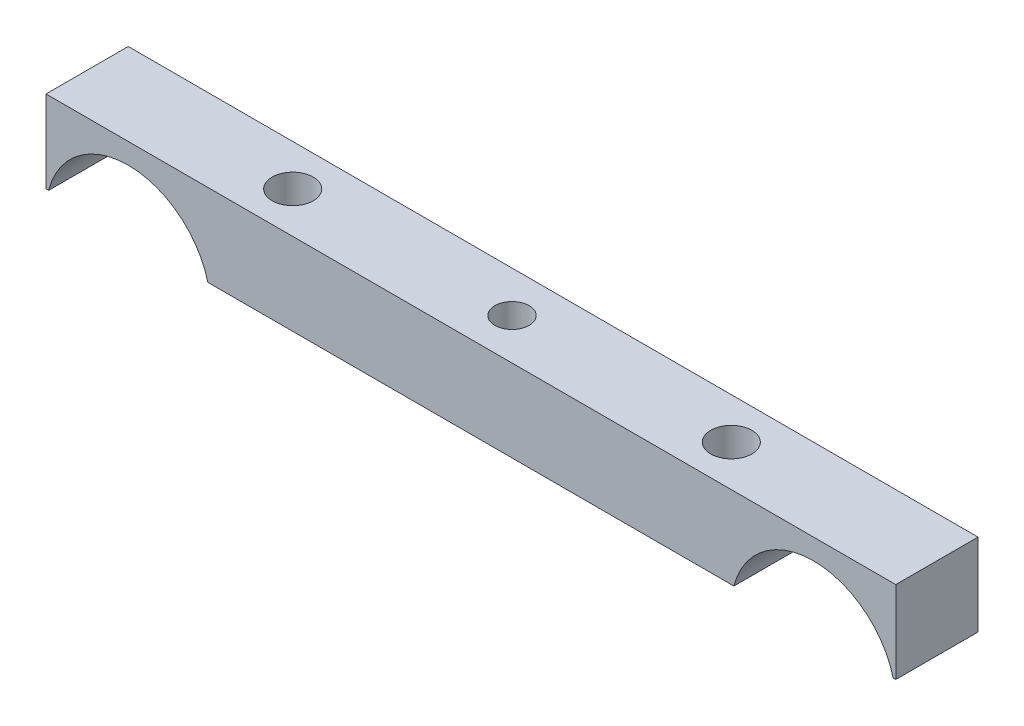
ISO-10303-21;
HEADER;
FILE_DESCRIPTION(('STEP AP214'),'2;1');
FILE_NAME('part.step','',(''),(''),'','','');
FILE_SCHEMA(('AUTOMOTIVE_DESIGN { 1 0 10303 214 1 1 1 1 }'));
ENDSEC;
DATA;
#1=APPLICATION_CONTEXT('core data for automotive mechanical design processes');
#2=APPLICATION_PROTOCOL_DEFINITION('international standard','automotive_design',2000,#1);
#3=PRODUCT_CONTEXT('',#1,'mechanical');
#4=PRODUCT('Part','Part','',(#3));
#5=PRODUCT_RELATED_PRODUCT_CATEGORY('part','',(#4));
#6=PRODUCT_DEFINITION_FORMATION('','',#4);
#7=PRODUCT_DEFINITION_CONTEXT('part definition',#1,'design');
#8=PRODUCT_DEFINITION('design','',#6,#7);
#9=PRODUCT_DEFINITION_SHAPE('','',#8);
#10=(LENGTH_UNIT() NAMED_UNIT(*) SI_UNIT(.MILLI.,.METRE.));
#11=(NAMED_UNIT(*) PLANE_ANGLE_UNIT() SI_UNIT($,.RADIAN.));
#12=(NAMED_UNIT(*) SI_UNIT($,.STERADIAN.) SOLID_ANGLE_UNIT());
#13=UNCERTAINTY_MEASURE_WITH_UNIT(LENGTH_MEASURE(1.E-05),#10,'distance_accuracy_value','');
#14=(GEOMETRIC_REPRESENTATION_CONTEXT(3) GLOBAL_UNCERTAINTY_ASSIGNED_CONTEXT((#13)) GLOBAL_UNIT_ASSIGNED_CONTEXT((#10,
#11,#12)) REPRESENTATION_CONTEXT('',''));
#15=CARTESIAN_POINT('',(0.,0.,0.));
#16=DIRECTION('',(0.,0.,1.));
#17=DIRECTION('',(1.,0.,0.));
#18=AXIS2_PLACEMENT_3D('',#15,#16,#17);
#19=CARTESIAN_POINT('',(-31.,7.5,6.));
#20=DIRECTION('',(0.,-1.,0.));
#21=DIRECTION('',(0.,0.,-1.));
#22=AXIS2_PLACEMENT_3D('',#19,#20,#21);
#23=PLANE('',#22);
#24=CARTESIAN_POINT('',(0.,7.5,3.));
#25=DIRECTION('',(0.,1.,0.));
#26=DIRECTION('',(0.,0.,1.));
#27=AXIS2_PLACEMENT_3D('',#24,#25,#26);
#28=CIRCLE('',#27,1.25);
#29=CARTESIAN_POINT('',(0.,7.5,4.25));
#30=VERTEX_POINT('',#29);
#31=EDGE_CURVE('E190',#30,#30,#28,.T.);
#32=ORIENTED_EDGE('',*,*,#31,.F.);
#33=EDGE_LOOP('',(#32));
#34=FACE_BOUND('',#33,.T.);
#35=CARTESIAN_POINT('',(16.,7.5,3.));
#36=DIRECTION('',(0.,1.,0.));
#37=DIRECTION('',(0.,0.,1.));
#38=AXIS2_PLACEMENT_3D('',#35,#36,#37);
#39=CIRCLE('',#38,1.5);
#40=CARTESIAN_POINT('',(16.,7.5,4.5));
#41=VERTEX_POINT('',#40);
#42=EDGE_CURVE('E184',#41,#41,#39,.T.);
#43=ORIENTED_EDGE('',*,*,#42,.F.);
#44=EDGE_LOOP('',(#43));
#45=FACE_BOUND('',#44,.T.);
#46=CARTESIAN_POINT('',(-16.,7.5,3.));
#47=DIRECTION('',(0.,1.,0.));
#48=DIRECTION('',(0.,0.,1.));
#49=AXIS2_PLACEMENT_3D('',#46,#47,#48);
#50=CIRCLE('',#49,1.5);
#51=CARTESIAN_POINT('',(-16.,7.5,4.5));
#52=VERTEX_POINT('',#51);
#53=EDGE_CURVE('E178',#52,#52,#50,.T.);
#54=ORIENTED_EDGE('',*,*,#53,.F.);
#55=EDGE_LOOP('',(#54));
#56=FACE_BOUND('',#55,.T.);
#57=DIRECTION('',(-1.,0.,0.));
#58=VECTOR('',#57,1.);
#59=CARTESIAN_POINT('',(-31.,7.5,0.));
#60=LINE('',#59,#58);
#61=CARTESIAN_POINT('',(31.,7.5,0.));
#62=VERTEX_POINT('',#61);
#63=CARTESIAN_POINT('',(-31.,7.5,0.));
#64=VERTEX_POINT('',#63);
#65=EDGE_CURVE('E130',#62,#64,#60,.T.);
#66=ORIENTED_EDGE('',*,*,#65,.T.);
#67=DIRECTION('',(0.,0.,-1.));
#68=VECTOR('',#67,1.);
#69=CARTESIAN_POINT('',(-31.,7.5,6.));
#70=LINE('',#69,#68);
#71=CARTESIAN_POINT('',(-31.,7.5,6.));
#72=VERTEX_POINT('',#71);
#73=EDGE_CURVE('E11',#72,#64,#70,.T.);
#74=ORIENTED_EDGE('',*,*,#73,.F.);
#75=DIRECTION('',(-1.,0.,0.));
#76=VECTOR('',#75,1.);
#77=CARTESIAN_POINT('',(-31.,7.5,6.));
#78=LINE('',#77,#76);
#79=CARTESIAN_POINT('',(31.,7.5,6.));
#80=VERTEX_POINT('',#79);
#81=EDGE_CURVE('E145',#80,#72,#78,.T.);
#82=ORIENTED_EDGE('',*,*,#81,.F.);
#83=DIRECTION('',(0.,0.,-1.));
#84=VECTOR('',#83,1.);
#85=CARTESIAN_POINT('',(31.,7.5,6.));
#86=LINE('',#85,#84);
#87=EDGE_CURVE('E126',#80,#62,#86,.T.);
#88=ORIENTED_EDGE('',*,*,#87,.T.);
#89=EDGE_LOOP('',(#66,#74,#82,#88));
#90=FACE_BOUND('',#89,.T.);
#91=ADVANCED_FACE('F34',(#34,#45,#56,#90),#23,.F.);
#92=CARTESIAN_POINT('',(-31.,1.5,6.));
#93=DIRECTION('',(1.,0.,0.));
#94=DIRECTION('',(0.,0.,-1.));
#95=AXIS2_PLACEMENT_3D('',#92,#93,#94);
#96=PLANE('',#95);
#97=DIRECTION('',(0.,-1.,0.));
#98=VECTOR('',#97,1.);
#99=CARTESIAN_POINT('',(-31.,1.5,0.));
#100=LINE('',#99,#98);
#101=CARTESIAN_POINT('',(-31.,1.5,0.));
#102=VERTEX_POINT('',#101);
#103=EDGE_CURVE('E133',#64,#102,#100,.T.);
#104=ORIENTED_EDGE('',*,*,#103,.T.);
#105=DIRECTION('',(0.,0.,-1.));
#106=VECTOR('',#105,1.);
#107=CARTESIAN_POINT('',(-31.,1.5,6.));
#108=LINE('',#107,#106);
#109=CARTESIAN_POINT('',(-31.,1.5,6.));
#110=VERTEX_POINT('',#109);
#111=EDGE_CURVE('E42',#110,#102,#108,.T.);
#112=ORIENTED_EDGE('',*,*,#111,.F.);
#113=DIRECTION('',(0.,-1.,0.));
#114=VECTOR('',#113,1.);
#115=CARTESIAN_POINT('',(-31.,1.5,6.));
#116=LINE('',#115,#114);
#117=EDGE_CURVE('E93',#72,#110,#116,.T.);
#118=ORIENTED_EDGE('',*,*,#117,.F.);
#119=ORIENTED_EDGE('',*,*,#73,.T.);
#120=EDGE_LOOP('',(#104,#112,#118,#119));
#121=FACE_BOUND('',#120,.T.);
#122=ADVANCED_FACE('F207',(#121),#96,.F.);
#123=CARTESIAN_POINT('',(-30.8094750193111,1.5,6.));
#124=DIRECTION('',(0.,1.,0.));
#125=DIRECTION('',(-1.,0.,0.));
#126=AXIS2_PLACEMENT_3D('',#123,#124,#125);
#127=PLANE('',#126);
#128=DIRECTION('',(1.,0.,0.));
#129=VECTOR('',#128,1.);
#130=CARTESIAN_POINT('',(-30.8094750193111,1.5,0.));
#131=LINE('',#130,#129);
#132=CARTESIAN_POINT('',(-30.8094750193111,1.5,0.));
#133=VERTEX_POINT('',#132);
#134=EDGE_CURVE('E136',#102,#133,#131,.T.);
#135=ORIENTED_EDGE('',*,*,#134,.T.);
#136=DIRECTION('',(0.,0.,-1.));
#137=VECTOR('',#136,1.);
#138=CARTESIAN_POINT('',(-30.8094750193111,1.5,6.));
#139=LINE('',#138,#137);
#140=CARTESIAN_POINT('',(-30.8094750193111,1.5,6.));
#141=VERTEX_POINT('',#140);
#142=EDGE_CURVE('E152',#141,#133,#139,.T.);
#143=ORIENTED_EDGE('',*,*,#142,.F.);
#144=DIRECTION('',(1.,0.,0.));
#145=VECTOR('',#144,1.);
#146=CARTESIAN_POINT('',(-30.8094750193111,1.5,6.));
#147=LINE('',#146,#145);
#148=EDGE_CURVE('E160',#110,#141,#147,.T.);
#149=ORIENTED_EDGE('',*,*,#148,.F.);
#150=ORIENTED_EDGE('',*,*,#111,.T.);
#151=EDGE_LOOP('',(#135,#143,#149,#150));
#152=FACE_BOUND('',#151,.T.);
#153=ADVANCED_FACE('F158',(#152),#127,.F.);
#154=CARTESIAN_POINT('',(-25.,0.,6.));
#155=DIRECTION('',(0.,0.,-1.));
#156=DIRECTION('',(-1.,0.,0.));
#157=AXIS2_PLACEMENT_3D('',#154,#155,#156);
#158=CYLINDRICAL_SURFACE('',#157,6.);
#159=CARTESIAN_POINT('',(-25.,0.,0.));
#160=DIRECTION('',(0.,0.,-1.));
#161=DIRECTION('',(1.,0.,0.));
#162=AXIS2_PLACEMENT_3D('',#159,#160,#161);
#163=CIRCLE('',#162,6.);
#164=CARTESIAN_POINT('',(-19.1905249806889,1.5,0.));
#165=VERTEX_POINT('',#164);
#166=EDGE_CURVE('E138',#133,#165,#163,.T.);
#167=ORIENTED_EDGE('',*,*,#166,.T.);
#168=DIRECTION('',(0.,0.,-1.));
#169=VECTOR('',#168,1.);
#170=CARTESIAN_POINT('',(-19.1905249806889,1.5,6.));
#171=LINE('',#170,#169);
#172=CARTESIAN_POINT('',(-19.1905249806889,1.5,6.));
#173=VERTEX_POINT('',#172);
#174=EDGE_CURVE('E149',#173,#165,#171,.T.);
#175=ORIENTED_EDGE('',*,*,#174,.F.);
#176=CARTESIAN_POINT('',(-25.,0.,6.));
#177=DIRECTION('',(0.,0.,-1.));
#178=DIRECTION('',(1.,0.,0.));
#179=AXIS2_PLACEMENT_3D('',#176,#177,#178);
#180=CIRCLE('',#179,6.);
#181=EDGE_CURVE('E172',#141,#173,#180,.T.);
#182=ORIENTED_EDGE('',*,*,#181,.F.);
#183=ORIENTED_EDGE('',*,*,#142,.T.);
#184=EDGE_LOOP('',(#167,#175,#182,#183));
#185=FACE_BOUND('',#184,.T.);
#186=ADVANCED_FACE('F168',(#185),#158,.F.);
#187=CARTESIAN_POINT('',(-19.1905249806889,1.5,6.));
#188=DIRECTION('',(0.,1.,0.));
#189=DIRECTION('',(0.,0.,1.));
#190=AXIS2_PLACEMENT_3D('',#187,#188,#189);
#191=PLANE('',#190);
#192=CARTESIAN_POINT('',(0.,1.5,3.));
#193=DIRECTION('',(0.,1.,0.));
#194=DIRECTION('',(0.,0.,1.));
#195=AXIS2_PLACEMENT_3D('',#192,#193,#194);
#196=CIRCLE('',#195,1.25);
#197=CARTESIAN_POINT('',(0.,1.5,4.25));
#198=VERTEX_POINT('',#197);
#199=EDGE_CURVE('E187',#198,#198,#196,.T.);
#200=ORIENTED_EDGE('',*,*,#199,.T.);
#201=EDGE_LOOP('',(#200));
#202=FACE_BOUND('',#201,.T.);
#203=CARTESIAN_POINT('',(16.,1.5,3.));
#204=DIRECTION('',(0.,1.,0.));
#205=DIRECTION('',(0.,0.,1.));
#206=AXIS2_PLACEMENT_3D('',#203,#204,#205);
#207=CIRCLE('',#206,1.5);
#208=CARTESIAN_POINT('',(16.,1.5,4.5));
#209=VERTEX_POINT('',#208);
#210=EDGE_CURVE('E181',#209,#209,#207,.T.);
#211=ORIENTED_EDGE('',*,*,#210,.T.);
#212=EDGE_LOOP('',(#211));
#213=FACE_BOUND('',#212,.T.);
#214=CARTESIAN_POINT('',(-16.,1.5,3.));
#215=DIRECTION('',(0.,1.,0.));
#216=DIRECTION('',(0.,0.,1.));
#217=AXIS2_PLACEMENT_3D('',#214,#215,#216);
#218=CIRCLE('',#217,1.5);
#219=CARTESIAN_POINT('',(-16.,1.5,4.5));
#220=VERTEX_POINT('',#219);
#221=EDGE_CURVE('E134',#220,#220,#218,.T.);
#222=ORIENTED_EDGE('',*,*,#221,.T.);
#223=EDGE_LOOP('',(#222));
#224=FACE_BOUND('',#223,.T.);
#225=DIRECTION('',(1.,0.,0.));
#226=VECTOR('',#225,1.);
#227=CARTESIAN_POINT('',(-19.1905249806889,1.5,0.));
#228=LINE('',#227,#226);
#229=CARTESIAN_POINT('',(19.1905249806889,1.5,0.));
#230=VERTEX_POINT('',#229);
#231=EDGE_CURVE('E140',#165,#230,#228,.T.);
#232=ORIENTED_EDGE('',*,*,#231,.T.);
#233=DIRECTION('',(0.,0.,-1.));
#234=VECTOR('',#233,1.);
#235=CARTESIAN_POINT('',(19.1905249806889,1.5,6.));
#236=LINE('',#235,#234);
#237=CARTESIAN_POINT('',(19.1905249806889,1.5,6.));
#238=VERTEX_POINT('',#237);
#239=EDGE_CURVE('E121',#238,#230,#236,.T.);
#240=ORIENTED_EDGE('',*,*,#239,.F.);
#241=DIRECTION('',(1.,0.,0.));
#242=VECTOR('',#241,1.);
#243=CARTESIAN_POINT('',(-19.1905249806889,1.5,6.));
#244=LINE('',#243,#242);
#245=EDGE_CURVE('E112',#173,#238,#244,.T.);
#246=ORIENTED_EDGE('',*,*,#245,.F.);
#247=ORIENTED_EDGE('',*,*,#174,.T.);
#248=EDGE_LOOP('',(#232,#240,#246,#247));
#249=FACE_BOUND('',#248,.T.);
#250=ADVANCED_FACE('F171',(#202,#213,#224,#249),#191,.F.);
#251=CARTESIAN_POINT('',(25.,0.,6.));
#252=DIRECTION('',(0.,0.,-1.));
#253=DIRECTION('',(-1.,0.,0.));
#254=AXIS2_PLACEMENT_3D('',#251,#252,#253);
#255=CYLINDRICAL_SURFACE('',#254,6.);
#256=CARTESIAN_POINT('',(25.,0.,0.));
#257=DIRECTION('',(0.,0.,-1.));
#258=DIRECTION('',(-1.,0.,0.));
#259=AXIS2_PLACEMENT_3D('',#256,#257,#258);
#260=CIRCLE('',#259,6.);
#261=CARTESIAN_POINT('',(30.8094750193111,1.5,0.));
#262=VERTEX_POINT('',#261);
#263=EDGE_CURVE('E120',#230,#262,#260,.T.);
#264=ORIENTED_EDGE('',*,*,#263,.T.);
#265=DIRECTION('',(0.,0.,-1.));
#266=VECTOR('',#265,1.);
#267=CARTESIAN_POINT('',(30.8094750193111,1.5,6.));
#268=LINE('',#267,#266);
#269=CARTESIAN_POINT('',(30.8094750193111,1.5,6.));
#270=VERTEX_POINT('',#269);
#271=EDGE_CURVE('E117',#270,#262,#268,.T.);
#272=ORIENTED_EDGE('',*,*,#271,.F.);
#273=CARTESIAN_POINT('',(25.,0.,6.));
#274=DIRECTION('',(0.,0.,-1.));
#275=DIRECTION('',(-1.,0.,0.));
#276=AXIS2_PLACEMENT_3D('',#273,#274,#275);
#277=CIRCLE('',#276,6.);
#278=EDGE_CURVE('E106',#238,#270,#277,.T.);
#279=ORIENTED_EDGE('',*,*,#278,.F.);
#280=ORIENTED_EDGE('',*,*,#239,.T.);
#281=EDGE_LOOP('',(#264,#272,#279,#280));
#282=FACE_BOUND('',#281,.T.);
#283=ADVANCED_FACE('F118',(#282),#255,.F.);
#284=CARTESIAN_POINT('',(31.,1.5,6.));
#285=DIRECTION('',(0.,1.,0.));
#286=DIRECTION('',(0.,0.,1.));
#287=AXIS2_PLACEMENT_3D('',#284,#285,#286);
#288=PLANE('',#287);
#289=DIRECTION('',(1.,0.,0.));
#290=VECTOR('',#289,1.);
#291=CARTESIAN_POINT('',(31.,1.5,0.));
#292=LINE('',#291,#290);
#293=CARTESIAN_POINT('',(31.,1.5,0.));
#294=VERTEX_POINT('',#293);
#295=EDGE_CURVE('E79',#262,#294,#292,.T.);
#296=ORIENTED_EDGE('',*,*,#295,.T.);
#297=DIRECTION('',(0.,0.,-1.));
#298=VECTOR('',#297,1.);
#299=CARTESIAN_POINT('',(31.,1.5,6.));
#300=LINE('',#299,#298);
#301=CARTESIAN_POINT('',(31.,1.5,6.));
#302=VERTEX_POINT('',#301);
#303=EDGE_CURVE('E122',#302,#294,#300,.T.);
#304=ORIENTED_EDGE('',*,*,#303,.F.);
#305=DIRECTION('',(1.,0.,0.));
#306=VECTOR('',#305,1.);
#307=CARTESIAN_POINT('',(31.,1.5,6.));
#308=LINE('',#307,#306);
#309=EDGE_CURVE('E110',#270,#302,#308,.T.);
#310=ORIENTED_EDGE('',*,*,#309,.F.);
#311=ORIENTED_EDGE('',*,*,#271,.T.);
#312=EDGE_LOOP('',(#296,#304,#310,#311));
#313=FACE_BOUND('',#312,.T.);
#314=ADVANCED_FACE('F124',(#313),#288,.F.);
#315=CARTESIAN_POINT('',(31.,7.5,6.));
#316=DIRECTION('',(-1.,0.,0.));
#317=DIRECTION('',(0.,-1.,0.));
#318=AXIS2_PLACEMENT_3D('',#315,#316,#317);
#319=PLANE('',#318);
#320=DIRECTION('',(0.,1.,0.));
#321=VECTOR('',#320,1.);
#322=CARTESIAN_POINT('',(31.,7.5,0.));
#323=LINE('',#322,#321);
#324=EDGE_CURVE('E85',#294,#62,#323,.T.);
#325=ORIENTED_EDGE('',*,*,#324,.T.);
#326=ORIENTED_EDGE('',*,*,#87,.F.);
#327=DIRECTION('',(0.,1.,0.));
#328=VECTOR('',#327,1.);
#329=CARTESIAN_POINT('',(31.,7.5,6.));
#330=LINE('',#329,#328);
#331=EDGE_CURVE('E50',#302,#80,#330,.T.);
#332=ORIENTED_EDGE('',*,*,#331,.F.);
#333=ORIENTED_EDGE('',*,*,#303,.T.);
#334=EDGE_LOOP('',(#325,#326,#332,#333));
#335=FACE_BOUND('',#334,.T.);
#336=ADVANCED_FACE('F214',(#335),#319,.F.);
#337=CARTESIAN_POINT('',(25.,0.,6.));
#338=DIRECTION('',(0.,0.,-1.));
#339=DIRECTION('',(-1.,0.,0.));
#340=AXIS2_PLACEMENT_3D('',#337,#338,#339);
#341=PLANE('',#340);
#342=ORIENTED_EDGE('',*,*,#81,.T.);
#343=ORIENTED_EDGE('',*,*,#117,.T.);
#344=ORIENTED_EDGE('',*,*,#148,.T.);
#345=ORIENTED_EDGE('',*,*,#181,.T.);
#346=ORIENTED_EDGE('',*,*,#245,.T.);
#347=ORIENTED_EDGE('',*,*,#278,.T.);
#348=ORIENTED_EDGE('',*,*,#309,.T.);
#349=ORIENTED_EDGE('',*,*,#331,.T.);
#350=EDGE_LOOP('',(#342,#343,#344,#345,#346,#347,#348,#349));
#351=FACE_BOUND('',#350,.T.);
#352=ADVANCED_FACE('F108',(#351),#341,.F.);
#353=CARTESIAN_POINT('',(25.,0.,0.));
#354=DIRECTION('',(0.,0.,-1.));
#355=DIRECTION('',(-1.,0.,0.));
#356=AXIS2_PLACEMENT_3D('',#353,#354,#355);
#357=PLANE('',#356);
#358=ORIENTED_EDGE('',*,*,#65,.F.);
#359=ORIENTED_EDGE('',*,*,#324,.F.);
#360=ORIENTED_EDGE('',*,*,#295,.F.);
#361=ORIENTED_EDGE('',*,*,#263,.F.);
#362=ORIENTED_EDGE('',*,*,#231,.F.);
#363=ORIENTED_EDGE('',*,*,#166,.F.);
#364=ORIENTED_EDGE('',*,*,#134,.F.);
#365=ORIENTED_EDGE('',*,*,#103,.F.);
#366=EDGE_LOOP('',(#358,#359,#360,#361,#362,#363,#364,#365));
#367=FACE_BOUND('',#366,.T.);
#368=ADVANCED_FACE('F164',(#367),#357,.T.);
#369=CARTESIAN_POINT('',(-16.,1.5,3.));
#370=DIRECTION('',(0.,1.,0.));
#371=DIRECTION('',(0.,0.,1.));
#372=AXIS2_PLACEMENT_3D('',#369,#370,#371);
#373=CYLINDRICAL_SURFACE('',#372,1.5);
#374=ORIENTED_EDGE('',*,*,#221,.F.);
#375=EDGE_LOOP('',(#374));
#376=FACE_BOUND('',#375,.T.);
#377=ORIENTED_EDGE('',*,*,#53,.T.);
#378=EDGE_LOOP('',(#377));
#379=FACE_BOUND('',#378,.T.);
#380=ADVANCED_FACE('F276',(#376,#379),#373,.F.);
#381=CARTESIAN_POINT('',(16.,1.5,3.));
#382=DIRECTION('',(0.,1.,0.));
#383=DIRECTION('',(0.,0.,1.));
#384=AXIS2_PLACEMENT_3D('',#381,#382,#383);
#385=CYLINDRICAL_SURFACE('',#384,1.5);
#386=ORIENTED_EDGE('',*,*,#210,.F.);
#387=EDGE_LOOP('',(#386));
#388=FACE_BOUND('',#387,.T.);
#389=ORIENTED_EDGE('',*,*,#42,.T.);
#390=EDGE_LOOP('',(#389));
#391=FACE_BOUND('',#390,.T.);
#392=ADVANCED_FACE('F201',(#388,#391),#385,.F.);
#393=CARTESIAN_POINT('',(0.,1.5,3.));
#394=DIRECTION('',(0.,1.,0.));
#395=DIRECTION('',(0.,0.,1.));
#396=AXIS2_PLACEMENT_3D('',#393,#394,#395);
#397=CYLINDRICAL_SURFACE('',#396,1.25);
#398=ORIENTED_EDGE('',*,*,#199,.F.);
#399=EDGE_LOOP('',(#398));
#400=FACE_BOUND('',#399,.T.);
#401=ORIENTED_EDGE('',*,*,#31,.T.);
#402=EDGE_LOOP('',(#401));
#403=FACE_BOUND('',#402,.T.);
#404=ADVANCED_FACE('F198',(#400,#403),#397,.F.);
#405=CLOSED_SHELL('',(#91,#122,#153,#186,#250,#283,#314,#336,#352,#368,#380,#392,#404));
#406=MANIFOLD_SOLID_BREP('B2',#405);
#407=ADVANCED_BREP_SHAPE_REPRESENTATION('',(#18,#406),#14);
#408=SHAPE_DEFINITION_REPRESENTATION(#9,#407);
ENDSEC;
END-ISO-10303-21;
